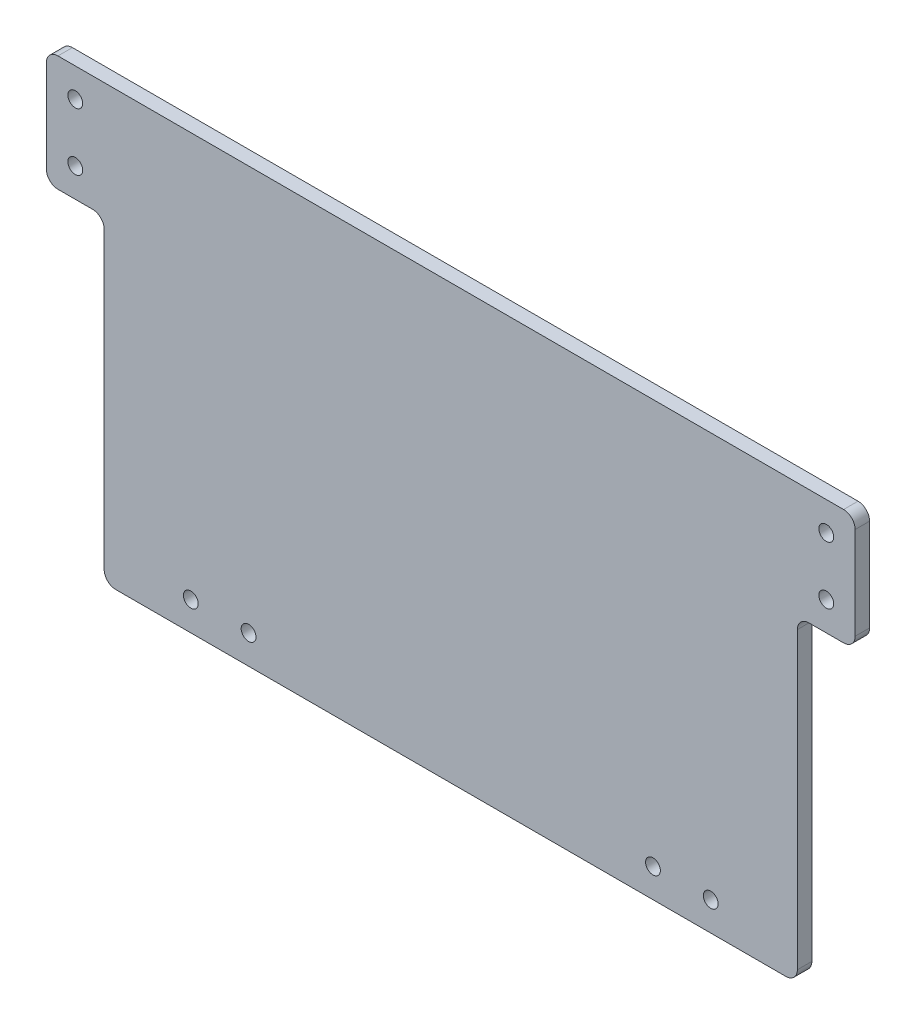
ISO-10303-21;
HEADER;
FILE_DESCRIPTION(('STEP AP214'),'2;1');
FILE_NAME('part.step','',(''),(''),'','','');
FILE_SCHEMA(('AUTOMOTIVE_DESIGN { 1 0 10303 214 1 1 1 1 }'));
ENDSEC;
DATA;
#1=APPLICATION_CONTEXT('core data for automotive mechanical design processes');
#2=APPLICATION_PROTOCOL_DEFINITION('international standard','automotive_design',2000,#1);
#3=PRODUCT_CONTEXT('',#1,'mechanical');
#4=PRODUCT('Part','Part','',(#3));
#5=PRODUCT_RELATED_PRODUCT_CATEGORY('part','',(#4));
#6=PRODUCT_DEFINITION_FORMATION('','',#4);
#7=PRODUCT_DEFINITION_CONTEXT('part definition',#1,'design');
#8=PRODUCT_DEFINITION('design','',#6,#7);
#9=PRODUCT_DEFINITION_SHAPE('','',#8);
#10=(LENGTH_UNIT() NAMED_UNIT(*) SI_UNIT(.MILLI.,.METRE.));
#11=(NAMED_UNIT(*) PLANE_ANGLE_UNIT() SI_UNIT($,.RADIAN.));
#12=(NAMED_UNIT(*) SI_UNIT($,.STERADIAN.) SOLID_ANGLE_UNIT());
#13=UNCERTAINTY_MEASURE_WITH_UNIT(LENGTH_MEASURE(1.E-05),#10,'distance_accuracy_value','');
#14=(GEOMETRIC_REPRESENTATION_CONTEXT(3) GLOBAL_UNCERTAINTY_ASSIGNED_CONTEXT((#13)) GLOBAL_UNIT_ASSIGNED_CONTEXT((#10,
#11,#12)) REPRESENTATION_CONTEXT('',''));
#15=CARTESIAN_POINT('',(0.,0.,0.));
#16=DIRECTION('',(0.,0.,1.));
#17=DIRECTION('',(1.,0.,0.));
#18=AXIS2_PLACEMENT_3D('',#15,#16,#17);
#19=CARTESIAN_POINT('',(152.4,95.25,6.35));
#20=DIRECTION('',(-1.,0.,0.));
#21=DIRECTION('',(0.,0.,1.));
#22=AXIS2_PLACEMENT_3D('',#19,#20,#21);
#23=PLANE('',#22);
#24=DIRECTION('',(0.,1.,0.));
#25=VECTOR('',#24,1.);
#26=CARTESIAN_POINT('',(152.4,95.25,6.35));
#27=LINE('',#26,#25);
#28=CARTESIAN_POINT('',(152.4,-90.17,6.35));
#29=VERTEX_POINT('',#28);
#30=CARTESIAN_POINT('',(152.4,39.37,6.35));
#31=VERTEX_POINT('',#30);
#32=EDGE_CURVE('E258',#29,#31,#27,.T.);
#33=ORIENTED_EDGE('',*,*,#32,.F.);
#34=DIRECTION('',(0.,0.,-1.));
#35=VECTOR('',#34,1.);
#36=CARTESIAN_POINT('',(152.4,-90.17,6.35));
#37=LINE('',#36,#35);
#38=CARTESIAN_POINT('',(152.4,-90.17,0.));
#39=VERTEX_POINT('',#38);
#40=EDGE_CURVE('E212',#29,#39,#37,.T.);
#41=ORIENTED_EDGE('',*,*,#40,.T.);
#42=DIRECTION('',(0.,1.,0.));
#43=VECTOR('',#42,1.);
#44=CARTESIAN_POINT('',(152.4,95.25,0.));
#45=LINE('',#44,#43);
#46=CARTESIAN_POINT('',(152.4,39.37,0.));
#47=VERTEX_POINT('',#46);
#48=EDGE_CURVE('E239',#39,#47,#45,.T.);
#49=ORIENTED_EDGE('',*,*,#48,.T.);
#50=DIRECTION('',(0.,0.,-1.));
#51=VECTOR('',#50,1.);
#52=CARTESIAN_POINT('',(152.4,39.37,6.35));
#53=LINE('',#52,#51);
#54=EDGE_CURVE('E210',#47,#31,#53,.F.);
#55=ORIENTED_EDGE('',*,*,#54,.T.);
#56=EDGE_LOOP('',(#33,#41,#49,#55));
#57=FACE_BOUND('',#56,.T.);
#58=ADVANCED_FACE('F33',(#57),#23,.F.);
#59=CARTESIAN_POINT('',(-152.4,95.25,6.35));
#60=DIRECTION('',(0.,-1.,0.));
#61=DIRECTION('',(0.,0.,-1.));
#62=AXIS2_PLACEMENT_3D('',#59,#60,#61);
#63=PLANE('',#62);
#64=DIRECTION('',(-1.,0.,0.));
#65=VECTOR('',#64,1.);
#66=CARTESIAN_POINT('',(-152.4,95.25,6.35));
#67=LINE('',#66,#65);
#68=CARTESIAN_POINT('',(172.72,95.25,6.35));
#69=VERTEX_POINT('',#68);
#70=CARTESIAN_POINT('',(-172.72,95.25,6.35));
#71=VERTEX_POINT('',#70);
#72=EDGE_CURVE('E313',#69,#71,#67,.T.);
#73=ORIENTED_EDGE('',*,*,#72,.F.);
#74=DIRECTION('',(0.,0.,-1.));
#75=VECTOR('',#74,1.);
#76=CARTESIAN_POINT('',(172.72,95.25,0.));
#77=LINE('',#76,#75);
#78=CARTESIAN_POINT('',(172.72,95.25,0.));
#79=VERTEX_POINT('',#78);
#80=EDGE_CURVE('E227',#69,#79,#77,.T.);
#81=ORIENTED_EDGE('',*,*,#80,.T.);
#82=DIRECTION('',(-1.,0.,0.));
#83=VECTOR('',#82,1.);
#84=CARTESIAN_POINT('',(-152.4,95.25,0.));
#85=LINE('',#84,#83);
#86=CARTESIAN_POINT('',(-172.72,95.25,0.));
#87=VERTEX_POINT('',#86);
#88=EDGE_CURVE('E249',#79,#87,#85,.T.);
#89=ORIENTED_EDGE('',*,*,#88,.T.);
#90=DIRECTION('',(0.,0.,-1.));
#91=VECTOR('',#90,1.);
#92=CARTESIAN_POINT('',(-172.72,95.25,6.35));
#93=LINE('',#92,#91);
#94=EDGE_CURVE('E225',#87,#71,#93,.F.);
#95=ORIENTED_EDGE('',*,*,#94,.T.);
#96=EDGE_LOOP('',(#73,#81,#89,#95));
#97=FACE_BOUND('',#96,.T.);
#98=ADVANCED_FACE('F350',(#97),#63,.F.);
#99=CARTESIAN_POINT('',(-152.4,95.25,6.35));
#100=DIRECTION('',(1.,0.,0.));
#101=DIRECTION('',(0.,1.,0.));
#102=AXIS2_PLACEMENT_3D('',#99,#100,#101);
#103=PLANE('',#102);
#104=DIRECTION('',(0.,-1.,0.));
#105=VECTOR('',#104,1.);
#106=CARTESIAN_POINT('',(-152.4,95.25,6.35));
#107=LINE('',#106,#105);
#108=CARTESIAN_POINT('',(-152.4,39.37,6.35));
#109=VERTEX_POINT('',#108);
#110=CARTESIAN_POINT('',(-152.4,-90.17,6.35));
#111=VERTEX_POINT('',#110);
#112=EDGE_CURVE('E317',#109,#111,#107,.T.);
#113=ORIENTED_EDGE('',*,*,#112,.F.);
#114=DIRECTION('',(0.,0.,-1.));
#115=VECTOR('',#114,1.);
#116=CARTESIAN_POINT('',(-152.4,39.37,0.));
#117=LINE('',#116,#115);
#118=CARTESIAN_POINT('',(-152.4,39.37,0.));
#119=VERTEX_POINT('',#118);
#120=EDGE_CURVE('E203',#109,#119,#117,.T.);
#121=ORIENTED_EDGE('',*,*,#120,.T.);
#122=DIRECTION('',(0.,-1.,0.));
#123=VECTOR('',#122,1.);
#124=CARTESIAN_POINT('',(-152.4,95.25,0.));
#125=LINE('',#124,#123);
#126=CARTESIAN_POINT('',(-152.4,-90.17,0.));
#127=VERTEX_POINT('',#126);
#128=EDGE_CURVE('E322',#119,#127,#125,.T.);
#129=ORIENTED_EDGE('',*,*,#128,.T.);
#130=DIRECTION('',(0.,0.,-1.));
#131=VECTOR('',#130,1.);
#132=CARTESIAN_POINT('',(-152.4,-90.17,6.35));
#133=LINE('',#132,#131);
#134=EDGE_CURVE('E158',#127,#111,#133,.F.);
#135=ORIENTED_EDGE('',*,*,#134,.T.);
#136=EDGE_LOOP('',(#113,#121,#129,#135));
#137=FACE_BOUND('',#136,.T.);
#138=ADVANCED_FACE('F336',(#137),#103,.F.);
#139=CARTESIAN_POINT('',(-152.4,-95.25,6.35));
#140=DIRECTION('',(0.,1.,0.));
#141=DIRECTION('',(0.,0.,1.));
#142=AXIS2_PLACEMENT_3D('',#139,#140,#141);
#143=PLANE('',#142);
#144=DIRECTION('',(1.,0.,0.));
#145=VECTOR('',#144,1.);
#146=CARTESIAN_POINT('',(-152.4,-95.25,6.35));
#147=LINE('',#146,#145);
#148=CARTESIAN_POINT('',(-147.32,-95.25,6.35));
#149=VERTEX_POINT('',#148);
#150=CARTESIAN_POINT('',(147.32,-95.25,6.35));
#151=VERTEX_POINT('',#150);
#152=EDGE_CURVE('E176',#149,#151,#147,.T.);
#153=ORIENTED_EDGE('',*,*,#152,.F.);
#154=DIRECTION('',(0.,0.,-1.));
#155=VECTOR('',#154,1.);
#156=CARTESIAN_POINT('',(-147.32,-95.25,6.35));
#157=LINE('',#156,#155);
#158=CARTESIAN_POINT('',(-147.32,-95.25,0.));
#159=VERTEX_POINT('',#158);
#160=EDGE_CURVE('E207',#149,#159,#157,.T.);
#161=ORIENTED_EDGE('',*,*,#160,.T.);
#162=DIRECTION('',(1.,0.,0.));
#163=VECTOR('',#162,1.);
#164=CARTESIAN_POINT('',(-152.4,-95.25,0.));
#165=LINE('',#164,#163);
#166=CARTESIAN_POINT('',(147.32,-95.25,0.));
#167=VERTEX_POINT('',#166);
#168=EDGE_CURVE('E314',#159,#167,#165,.T.);
#169=ORIENTED_EDGE('',*,*,#168,.T.);
#170=DIRECTION('',(0.,0.,-1.));
#171=VECTOR('',#170,1.);
#172=CARTESIAN_POINT('',(147.32,-95.25,6.35));
#173=LINE('',#172,#171);
#174=EDGE_CURVE('E48',#167,#151,#173,.F.);
#175=ORIENTED_EDGE('',*,*,#174,.T.);
#176=EDGE_LOOP('',(#153,#161,#169,#175));
#177=FACE_BOUND('',#176,.T.);
#178=ADVANCED_FACE('F325',(#177),#143,.F.);
#179=CARTESIAN_POINT('',(0.,0.,6.35));
#180=DIRECTION('',(0.,0.,1.));
#181=DIRECTION('',(1.,0.,0.));
#182=AXIS2_PLACEMENT_3D('',#179,#180,#181);
#183=PLANE('',#182);
#184=CARTESIAN_POINT('',(-88.9,-82.55,6.35));
#185=DIRECTION('',(0.,0.,1.));
#186=DIRECTION('',(1.,0.,0.));
#187=AXIS2_PLACEMENT_3D('',#184,#185,#186);
#188=CIRCLE('',#187,3.26389999999999);
#189=CARTESIAN_POINT('',(-85.6361,-82.55,6.35));
#190=VERTEX_POINT('',#189);
#191=EDGE_CURVE('E294',#190,#190,#188,.T.);
#192=ORIENTED_EDGE('',*,*,#191,.F.);
#193=EDGE_LOOP('',(#192));
#194=FACE_BOUND('',#193,.T.);
#195=CARTESIAN_POINT('',(88.9,-82.55,6.35));
#196=DIRECTION('',(0.,0.,1.));
#197=DIRECTION('',(1.,0.,0.));
#198=AXIS2_PLACEMENT_3D('',#195,#196,#197);
#199=CIRCLE('',#198,3.26389999999999);
#200=CARTESIAN_POINT('',(92.1639,-82.55,6.35));
#201=VERTEX_POINT('',#200);
#202=EDGE_CURVE('E300',#201,#201,#199,.T.);
#203=ORIENTED_EDGE('',*,*,#202,.F.);
#204=EDGE_LOOP('',(#203));
#205=FACE_BOUND('',#204,.T.);
#206=CARTESIAN_POINT('',(114.3,-82.55,6.35));
#207=DIRECTION('',(0.,0.,1.));
#208=DIRECTION('',(1.,0.,0.));
#209=AXIS2_PLACEMENT_3D('',#206,#207,#208);
#210=CIRCLE('',#209,3.26389999999998);
#211=CARTESIAN_POINT('',(117.5639,-82.55,6.35));
#212=VERTEX_POINT('',#211);
#213=EDGE_CURVE('E286',#212,#212,#210,.T.);
#214=ORIENTED_EDGE('',*,*,#213,.F.);
#215=EDGE_LOOP('',(#214));
#216=FACE_BOUND('',#215,.T.);
#217=CARTESIAN_POINT('',(-114.3,-82.55,6.35));
#218=DIRECTION('',(0.,0.,1.));
#219=DIRECTION('',(1.,0.,0.));
#220=AXIS2_PLACEMENT_3D('',#217,#218,#219);
#221=CIRCLE('',#220,3.26389999999998);
#222=CARTESIAN_POINT('',(-111.0361,-82.55,6.35));
#223=VERTEX_POINT('',#222);
#224=EDGE_CURVE('E293',#223,#223,#221,.T.);
#225=ORIENTED_EDGE('',*,*,#224,.F.);
#226=EDGE_LOOP('',(#225));
#227=FACE_BOUND('',#226,.T.);
#228=DIRECTION('',(0.,-1.,0.));
#229=VECTOR('',#228,1.);
#230=CARTESIAN_POINT('',(-177.8,95.25,6.35));
#231=LINE('',#230,#229);
#232=CARTESIAN_POINT('',(-177.8,90.17,6.35));
#233=VERTEX_POINT('',#232);
#234=CARTESIAN_POINT('',(-177.8,49.53,6.35));
#235=VERTEX_POINT('',#234);
#236=EDGE_CURVE('E154',#233,#235,#231,.T.);
#237=ORIENTED_EDGE('',*,*,#236,.T.);
#238=CARTESIAN_POINT('',(-172.72,49.53,6.35));
#239=DIRECTION('',(0.,0.,1.));
#240=DIRECTION('',(1.,0.,0.));
#241=AXIS2_PLACEMENT_3D('',#238,#239,#240);
#242=CIRCLE('',#241,5.08);
#243=CARTESIAN_POINT('',(-172.72,44.45,6.35));
#244=VERTEX_POINT('',#243);
#245=EDGE_CURVE('E147',#235,#244,#242,.T.);
#246=ORIENTED_EDGE('',*,*,#245,.T.);
#247=DIRECTION('',(1.,0.,0.));
#248=VECTOR('',#247,1.);
#249=CARTESIAN_POINT('',(-152.4,44.45,6.35));
#250=LINE('',#249,#248);
#251=CARTESIAN_POINT('',(-157.48,44.45,6.35));
#252=VERTEX_POINT('',#251);
#253=EDGE_CURVE('E151',#244,#252,#250,.T.);
#254=ORIENTED_EDGE('',*,*,#253,.T.);
#255=CARTESIAN_POINT('',(-157.48,39.37,6.35));
#256=DIRECTION('',(0.,0.,1.));
#257=DIRECTION('',(1.,0.,0.));
#258=AXIS2_PLACEMENT_3D('',#255,#256,#257);
#259=CIRCLE('',#258,5.08);
#260=EDGE_CURVE('E232',#252,#109,#259,.F.);
#261=ORIENTED_EDGE('',*,*,#260,.T.);
#262=ORIENTED_EDGE('',*,*,#112,.T.);
#263=CARTESIAN_POINT('',(-147.32,-90.17,6.35));
#264=DIRECTION('',(0.,0.,1.));
#265=DIRECTION('',(1.,0.,0.));
#266=AXIS2_PLACEMENT_3D('',#263,#264,#265);
#267=CIRCLE('',#266,5.08);
#268=EDGE_CURVE('E55',#111,#149,#267,.T.);
#269=ORIENTED_EDGE('',*,*,#268,.T.);
#270=ORIENTED_EDGE('',*,*,#152,.T.);
#271=CARTESIAN_POINT('',(147.32,-90.17,6.35));
#272=DIRECTION('',(0.,0.,1.));
#273=DIRECTION('',(1.,0.,0.));
#274=AXIS2_PLACEMENT_3D('',#271,#272,#273);
#275=CIRCLE('',#274,5.08);
#276=EDGE_CURVE('E199',#151,#29,#275,.T.);
#277=ORIENTED_EDGE('',*,*,#276,.T.);
#278=ORIENTED_EDGE('',*,*,#32,.T.);
#279=CARTESIAN_POINT('',(157.48,39.37,6.35));
#280=DIRECTION('',(0.,0.,1.));
#281=DIRECTION('',(1.,0.,0.));
#282=AXIS2_PLACEMENT_3D('',#279,#280,#281);
#283=CIRCLE('',#282,5.08);
#284=CARTESIAN_POINT('',(157.48,44.45,6.35));
#285=VERTEX_POINT('',#284);
#286=EDGE_CURVE('E11',#31,#285,#283,.F.);
#287=ORIENTED_EDGE('',*,*,#286,.T.);
#288=DIRECTION('',(-1.,0.,0.));
#289=VECTOR('',#288,1.);
#290=CARTESIAN_POINT('',(152.4,44.45,6.35));
#291=LINE('',#290,#289);
#292=CARTESIAN_POINT('',(172.72,44.45,6.35));
#293=VERTEX_POINT('',#292);
#294=EDGE_CURVE('E256',#293,#285,#291,.T.);
#295=ORIENTED_EDGE('',*,*,#294,.F.);
#296=CARTESIAN_POINT('',(172.72,49.53,6.35));
#297=DIRECTION('',(0.,0.,1.));
#298=DIRECTION('',(1.,0.,0.));
#299=AXIS2_PLACEMENT_3D('',#296,#297,#298);
#300=CIRCLE('',#299,5.08);
#301=CARTESIAN_POINT('',(177.8,49.53,6.35));
#302=VERTEX_POINT('',#301);
#303=EDGE_CURVE('E197',#293,#302,#300,.T.);
#304=ORIENTED_EDGE('',*,*,#303,.T.);
#305=DIRECTION('',(0.,-1.,0.));
#306=VECTOR('',#305,1.);
#307=CARTESIAN_POINT('',(177.8,95.25,6.35));
#308=LINE('',#307,#306);
#309=CARTESIAN_POINT('',(177.8,90.17,6.35));
#310=VERTEX_POINT('',#309);
#311=EDGE_CURVE('E262',#310,#302,#308,.T.);
#312=ORIENTED_EDGE('',*,*,#311,.F.);
#313=CARTESIAN_POINT('',(172.72,90.17,6.35));
#314=DIRECTION('',(0.,0.,1.));
#315=DIRECTION('',(1.,0.,0.));
#316=AXIS2_PLACEMENT_3D('',#313,#314,#315);
#317=CIRCLE('',#316,5.08);
#318=EDGE_CURVE('E195',#310,#69,#317,.T.);
#319=ORIENTED_EDGE('',*,*,#318,.T.);
#320=ORIENTED_EDGE('',*,*,#72,.T.);
#321=CARTESIAN_POINT('',(-172.72,90.17,6.35));
#322=DIRECTION('',(0.,0.,1.));
#323=DIRECTION('',(1.,0.,0.));
#324=AXIS2_PLACEMENT_3D('',#321,#322,#323);
#325=CIRCLE('',#324,5.08);
#326=EDGE_CURVE('E193',#71,#233,#325,.T.);
#327=ORIENTED_EDGE('',*,*,#326,.T.);
#328=EDGE_LOOP('',(#237,#246,#254,#261,#262,#269,#270,#277,#278,#287,#295,#304,#312,#319,#320,#327));
#329=FACE_BOUND('',#328,.T.);
#330=CARTESIAN_POINT('',(-165.1,57.15,6.35));
#331=DIRECTION('',(0.,0.,1.));
#332=DIRECTION('',(1.,0.,0.));
#333=AXIS2_PLACEMENT_3D('',#330,#331,#332);
#334=CIRCLE('',#333,3.26389999999998);
#335=CARTESIAN_POINT('',(-161.8361,57.15,6.35));
#336=VERTEX_POINT('',#335);
#337=EDGE_CURVE('E272',#336,#336,#334,.T.);
#338=ORIENTED_EDGE('',*,*,#337,.F.);
#339=EDGE_LOOP('',(#338));
#340=FACE_BOUND('',#339,.T.);
#341=CARTESIAN_POINT('',(-165.1,82.55,6.35));
#342=DIRECTION('',(0.,0.,1.));
#343=DIRECTION('',(1.,0.,0.));
#344=AXIS2_PLACEMENT_3D('',#341,#342,#343);
#345=CIRCLE('',#344,3.26389999999998);
#346=CARTESIAN_POINT('',(-161.8361,82.55,6.35));
#347=VERTEX_POINT('',#346);
#348=EDGE_CURVE('E168',#347,#347,#345,.T.);
#349=ORIENTED_EDGE('',*,*,#348,.F.);
#350=EDGE_LOOP('',(#349));
#351=FACE_BOUND('',#350,.T.);
#352=CARTESIAN_POINT('',(165.1,57.15,6.35));
#353=DIRECTION('',(0.,0.,1.));
#354=DIRECTION('',(1.,0.,0.));
#355=AXIS2_PLACEMENT_3D('',#352,#353,#354);
#356=CIRCLE('',#355,3.26389999999998);
#357=CARTESIAN_POINT('',(168.3639,57.15,6.35));
#358=VERTEX_POINT('',#357);
#359=EDGE_CURVE('E268',#358,#358,#356,.F.);
#360=ORIENTED_EDGE('',*,*,#359,.T.);
#361=EDGE_LOOP('',(#360));
#362=FACE_BOUND('',#361,.T.);
#363=CARTESIAN_POINT('',(165.1,82.55,6.35));
#364=DIRECTION('',(0.,0.,1.));
#365=DIRECTION('',(1.,0.,0.));
#366=AXIS2_PLACEMENT_3D('',#363,#364,#365);
#367=CIRCLE('',#366,3.26389999999998);
#368=CARTESIAN_POINT('',(168.3639,82.55,6.35));
#369=VERTEX_POINT('',#368);
#370=EDGE_CURVE('E289',#369,#369,#367,.F.);
#371=ORIENTED_EDGE('',*,*,#370,.T.);
#372=EDGE_LOOP('',(#371));
#373=FACE_BOUND('',#372,.T.);
#374=ADVANCED_FACE('F149',(#194,#205,#216,#227,#329,#340,#351,#362,#373),#183,.T.);
#375=CARTESIAN_POINT('',(0.,0.,0.));
#376=DIRECTION('',(0.,0.,1.));
#377=DIRECTION('',(1.,0.,0.));
#378=AXIS2_PLACEMENT_3D('',#375,#376,#377);
#379=PLANE('',#378);
#380=CARTESIAN_POINT('',(-88.9,-82.55,0.));
#381=DIRECTION('',(0.,0.,1.));
#382=DIRECTION('',(1.,0.,0.));
#383=AXIS2_PLACEMENT_3D('',#380,#381,#382);
#384=CIRCLE('',#383,3.26389999999999);
#385=CARTESIAN_POINT('',(-85.6361,-82.55,0.));
#386=VERTEX_POINT('',#385);
#387=EDGE_CURVE('E290',#386,#386,#384,.T.);
#388=ORIENTED_EDGE('',*,*,#387,.T.);
#389=EDGE_LOOP('',(#388));
#390=FACE_BOUND('',#389,.T.);
#391=CARTESIAN_POINT('',(88.9,-82.55,0.));
#392=DIRECTION('',(0.,0.,1.));
#393=DIRECTION('',(1.,0.,0.));
#394=AXIS2_PLACEMENT_3D('',#391,#392,#393);
#395=CIRCLE('',#394,3.26389999999999);
#396=CARTESIAN_POINT('',(92.1639,-82.55,0.));
#397=VERTEX_POINT('',#396);
#398=EDGE_CURVE('E297',#397,#397,#395,.T.);
#399=ORIENTED_EDGE('',*,*,#398,.T.);
#400=EDGE_LOOP('',(#399));
#401=FACE_BOUND('',#400,.T.);
#402=CARTESIAN_POINT('',(114.3,-82.55,0.));
#403=DIRECTION('',(0.,0.,1.));
#404=DIRECTION('',(1.,0.,0.));
#405=AXIS2_PLACEMENT_3D('',#402,#403,#404);
#406=CIRCLE('',#405,3.26389999999998);
#407=CARTESIAN_POINT('',(117.5639,-82.55,0.));
#408=VERTEX_POINT('',#407);
#409=EDGE_CURVE('E303',#408,#408,#406,.T.);
#410=ORIENTED_EDGE('',*,*,#409,.T.);
#411=EDGE_LOOP('',(#410));
#412=FACE_BOUND('',#411,.T.);
#413=CARTESIAN_POINT('',(-114.3,-82.55,0.));
#414=DIRECTION('',(0.,0.,1.));
#415=DIRECTION('',(1.,0.,0.));
#416=AXIS2_PLACEMENT_3D('',#413,#414,#415);
#417=CIRCLE('',#416,3.26389999999998);
#418=CARTESIAN_POINT('',(-111.0361,-82.55,0.));
#419=VERTEX_POINT('',#418);
#420=EDGE_CURVE('E250',#419,#419,#417,.T.);
#421=ORIENTED_EDGE('',*,*,#420,.T.);
#422=EDGE_LOOP('',(#421));
#423=FACE_BOUND('',#422,.T.);
#424=DIRECTION('',(1.,0.,0.));
#425=VECTOR('',#424,1.);
#426=CARTESIAN_POINT('',(-152.4,44.45,0.));
#427=LINE('',#426,#425);
#428=CARTESIAN_POINT('',(-172.72,44.45,0.));
#429=VERTEX_POINT('',#428);
#430=CARTESIAN_POINT('',(-157.48,44.45,0.));
#431=VERTEX_POINT('',#430);
#432=EDGE_CURVE('E284',#429,#431,#427,.T.);
#433=ORIENTED_EDGE('',*,*,#432,.F.);
#434=CARTESIAN_POINT('',(-172.72,49.53,0.));
#435=DIRECTION('',(0.,0.,1.));
#436=DIRECTION('',(1.,0.,0.));
#437=AXIS2_PLACEMENT_3D('',#434,#435,#436);
#438=CIRCLE('',#437,5.08);
#439=CARTESIAN_POINT('',(-177.8,49.53,0.));
#440=VERTEX_POINT('',#439);
#441=EDGE_CURVE('E171',#429,#440,#438,.F.);
#442=ORIENTED_EDGE('',*,*,#441,.T.);
#443=DIRECTION('',(0.,-1.,0.));
#444=VECTOR('',#443,1.);
#445=CARTESIAN_POINT('',(-177.8,95.25,0.));
#446=LINE('',#445,#444);
#447=CARTESIAN_POINT('',(-177.8,90.17,0.));
#448=VERTEX_POINT('',#447);
#449=EDGE_CURVE('E281',#448,#440,#446,.T.);
#450=ORIENTED_EDGE('',*,*,#449,.F.);
#451=CARTESIAN_POINT('',(-172.72,90.17,0.));
#452=DIRECTION('',(0.,0.,1.));
#453=DIRECTION('',(1.,0.,0.));
#454=AXIS2_PLACEMENT_3D('',#451,#452,#453);
#455=CIRCLE('',#454,5.08);
#456=EDGE_CURVE('E172',#448,#87,#455,.F.);
#457=ORIENTED_EDGE('',*,*,#456,.T.);
#458=ORIENTED_EDGE('',*,*,#88,.F.);
#459=CARTESIAN_POINT('',(172.72,90.17,0.));
#460=DIRECTION('',(0.,0.,1.));
#461=DIRECTION('',(1.,0.,0.));
#462=AXIS2_PLACEMENT_3D('',#459,#460,#461);
#463=CIRCLE('',#462,5.08);
#464=CARTESIAN_POINT('',(177.8,90.17,0.));
#465=VERTEX_POINT('',#464);
#466=EDGE_CURVE('E174',#79,#465,#463,.F.);
#467=ORIENTED_EDGE('',*,*,#466,.T.);
#468=DIRECTION('',(0.,-1.,0.));
#469=VECTOR('',#468,1.);
#470=CARTESIAN_POINT('',(177.8,95.25,0.));
#471=LINE('',#470,#469);
#472=CARTESIAN_POINT('',(177.8,49.53,0.));
#473=VERTEX_POINT('',#472);
#474=EDGE_CURVE('E358',#465,#473,#471,.T.);
#475=ORIENTED_EDGE('',*,*,#474,.T.);
#476=CARTESIAN_POINT('',(172.72,49.53,0.));
#477=DIRECTION('',(0.,0.,1.));
#478=DIRECTION('',(1.,0.,0.));
#479=AXIS2_PLACEMENT_3D('',#476,#477,#478);
#480=CIRCLE('',#479,5.08);
#481=CARTESIAN_POINT('',(172.72,44.45,0.));
#482=VERTEX_POINT('',#481);
#483=EDGE_CURVE('E181',#473,#482,#480,.F.);
#484=ORIENTED_EDGE('',*,*,#483,.T.);
#485=DIRECTION('',(-1.,0.,0.));
#486=VECTOR('',#485,1.);
#487=CARTESIAN_POINT('',(152.4,44.45,0.));
#488=LINE('',#487,#486);
#489=CARTESIAN_POINT('',(157.48,44.45,0.));
#490=VERTEX_POINT('',#489);
#491=EDGE_CURVE('E241',#482,#490,#488,.T.);
#492=ORIENTED_EDGE('',*,*,#491,.T.);
#493=CARTESIAN_POINT('',(157.48,39.37,0.));
#494=DIRECTION('',(0.,0.,1.));
#495=DIRECTION('',(1.,0.,0.));
#496=AXIS2_PLACEMENT_3D('',#493,#494,#495);
#497=CIRCLE('',#496,5.08);
#498=EDGE_CURVE('E41',#490,#47,#497,.T.);
#499=ORIENTED_EDGE('',*,*,#498,.T.);
#500=ORIENTED_EDGE('',*,*,#48,.F.);
#501=CARTESIAN_POINT('',(147.32,-90.17,0.));
#502=DIRECTION('',(0.,0.,1.));
#503=DIRECTION('',(1.,0.,0.));
#504=AXIS2_PLACEMENT_3D('',#501,#502,#503);
#505=CIRCLE('',#504,5.08);
#506=EDGE_CURVE('E183',#39,#167,#505,.F.);
#507=ORIENTED_EDGE('',*,*,#506,.T.);
#508=ORIENTED_EDGE('',*,*,#168,.F.);
#509=CARTESIAN_POINT('',(-147.32,-90.17,0.));
#510=DIRECTION('',(0.,0.,1.));
#511=DIRECTION('',(1.,0.,0.));
#512=AXIS2_PLACEMENT_3D('',#509,#510,#511);
#513=CIRCLE('',#512,5.08);
#514=EDGE_CURVE('E185',#159,#127,#513,.F.);
#515=ORIENTED_EDGE('',*,*,#514,.T.);
#516=ORIENTED_EDGE('',*,*,#128,.F.);
#517=CARTESIAN_POINT('',(-157.48,39.37,0.));
#518=DIRECTION('',(0.,0.,1.));
#519=DIRECTION('',(1.,0.,0.));
#520=AXIS2_PLACEMENT_3D('',#517,#518,#519);
#521=CIRCLE('',#520,5.08);
#522=EDGE_CURVE('E230',#119,#431,#521,.T.);
#523=ORIENTED_EDGE('',*,*,#522,.T.);
#524=EDGE_LOOP('',(#433,#442,#450,#457,#458,#467,#475,#484,#492,#499,#500,#507,#508,#515,#516,#523));
#525=FACE_BOUND('',#524,.T.);
#526=CARTESIAN_POINT('',(-165.1,82.55,0.));
#527=DIRECTION('',(0.,0.,1.));
#528=DIRECTION('',(1.,0.,0.));
#529=AXIS2_PLACEMENT_3D('',#526,#527,#528);
#530=CIRCLE('',#529,3.26389999999998);
#531=CARTESIAN_POINT('',(-161.8361,82.55,0.));
#532=VERTEX_POINT('',#531);
#533=EDGE_CURVE('E278',#532,#532,#530,.T.);
#534=ORIENTED_EDGE('',*,*,#533,.T.);
#535=EDGE_LOOP('',(#534));
#536=FACE_BOUND('',#535,.T.);
#537=CARTESIAN_POINT('',(-165.1,57.15,0.));
#538=DIRECTION('',(0.,0.,1.));
#539=DIRECTION('',(1.,0.,0.));
#540=AXIS2_PLACEMENT_3D('',#537,#538,#539);
#541=CIRCLE('',#540,3.26389999999998);
#542=CARTESIAN_POINT('',(-161.8361,57.15,0.));
#543=VERTEX_POINT('',#542);
#544=EDGE_CURVE('E275',#543,#543,#541,.T.);
#545=ORIENTED_EDGE('',*,*,#544,.T.);
#546=EDGE_LOOP('',(#545));
#547=FACE_BOUND('',#546,.T.);
#548=CARTESIAN_POINT('',(165.1,57.15,0.));
#549=DIRECTION('',(0.,0.,-1.));
#550=DIRECTION('',(-1.,0.,0.));
#551=AXIS2_PLACEMENT_3D('',#548,#549,#550);
#552=CIRCLE('',#551,3.26389999999998);
#553=CARTESIAN_POINT('',(161.8361,57.15,0.));
#554=VERTEX_POINT('',#553);
#555=EDGE_CURVE('E363',#554,#554,#552,.T.);
#556=ORIENTED_EDGE('',*,*,#555,.F.);
#557=EDGE_LOOP('',(#556));
#558=FACE_BOUND('',#557,.T.);
#559=CARTESIAN_POINT('',(165.1,82.55,0.));
#560=DIRECTION('',(0.,0.,-1.));
#561=DIRECTION('',(-1.,0.,0.));
#562=AXIS2_PLACEMENT_3D('',#559,#560,#561);
#563=CIRCLE('',#562,3.26389999999998);
#564=CARTESIAN_POINT('',(161.8361,82.55,0.));
#565=VERTEX_POINT('',#564);
#566=EDGE_CURVE('E265',#565,#565,#563,.T.);
#567=ORIENTED_EDGE('',*,*,#566,.F.);
#568=EDGE_LOOP('',(#567));
#569=FACE_BOUND('',#568,.T.);
#570=ADVANCED_FACE('F237',(#390,#401,#412,#423,#525,#536,#547,#558,#569),#379,.F.);
#571=CARTESIAN_POINT('',(-114.3,-82.55,0.));
#572=DIRECTION('',(0.,0.,1.));
#573=DIRECTION('',(1.,0.,0.));
#574=AXIS2_PLACEMENT_3D('',#571,#572,#573);
#575=CYLINDRICAL_SURFACE('',#574,3.26389999999998);
#576=ORIENTED_EDGE('',*,*,#420,.F.);
#577=EDGE_LOOP('',(#576));
#578=FACE_BOUND('',#577,.T.);
#579=ORIENTED_EDGE('',*,*,#224,.T.);
#580=EDGE_LOOP('',(#579));
#581=FACE_BOUND('',#580,.T.);
#582=ADVANCED_FACE('F506',(#578,#581),#575,.F.);
#583=CARTESIAN_POINT('',(114.3,-82.55,0.));
#584=DIRECTION('',(0.,0.,1.));
#585=DIRECTION('',(1.,0.,0.));
#586=AXIS2_PLACEMENT_3D('',#583,#584,#585);
#587=CYLINDRICAL_SURFACE('',#586,3.26389999999998);
#588=ORIENTED_EDGE('',*,*,#409,.F.);
#589=EDGE_LOOP('',(#588));
#590=FACE_BOUND('',#589,.T.);
#591=ORIENTED_EDGE('',*,*,#213,.T.);
#592=EDGE_LOOP('',(#591));
#593=FACE_BOUND('',#592,.T.);
#594=ADVANCED_FACE('F586',(#590,#593),#587,.F.);
#595=CARTESIAN_POINT('',(88.9,-82.55,0.));
#596=DIRECTION('',(0.,0.,1.));
#597=DIRECTION('',(1.,0.,0.));
#598=AXIS2_PLACEMENT_3D('',#595,#596,#597);
#599=CYLINDRICAL_SURFACE('',#598,3.26389999999999);
#600=ORIENTED_EDGE('',*,*,#398,.F.);
#601=EDGE_LOOP('',(#600));
#602=FACE_BOUND('',#601,.T.);
#603=ORIENTED_EDGE('',*,*,#202,.T.);
#604=EDGE_LOOP('',(#603));
#605=FACE_BOUND('',#604,.T.);
#606=ADVANCED_FACE('F576',(#602,#605),#599,.F.);
#607=CARTESIAN_POINT('',(-88.9,-82.55,0.));
#608=DIRECTION('',(0.,0.,1.));
#609=DIRECTION('',(1.,0.,0.));
#610=AXIS2_PLACEMENT_3D('',#607,#608,#609);
#611=CYLINDRICAL_SURFACE('',#610,3.26389999999999);
#612=ORIENTED_EDGE('',*,*,#387,.F.);
#613=EDGE_LOOP('',(#612));
#614=FACE_BOUND('',#613,.T.);
#615=ORIENTED_EDGE('',*,*,#191,.T.);
#616=EDGE_LOOP('',(#615));
#617=FACE_BOUND('',#616,.T.);
#618=ADVANCED_FACE('F496',(#614,#617),#611,.F.);
#619=CARTESIAN_POINT('',(-152.4,44.45,63.1461266284947));
#620=DIRECTION('',(0.,1.,0.));
#621=DIRECTION('',(0.,0.,1.));
#622=AXIS2_PLACEMENT_3D('',#619,#620,#621);
#623=PLANE('',#622);
#624=ORIENTED_EDGE('',*,*,#253,.F.);
#625=DIRECTION('',(0.,0.,-1.));
#626=VECTOR('',#625,1.);
#627=CARTESIAN_POINT('',(-172.72,44.45,63.1461266284947));
#628=LINE('',#627,#626);
#629=EDGE_CURVE('E164',#244,#429,#628,.T.);
#630=ORIENTED_EDGE('',*,*,#629,.T.);
#631=ORIENTED_EDGE('',*,*,#432,.T.);
#632=DIRECTION('',(0.,0.,-1.));
#633=VECTOR('',#632,1.);
#634=CARTESIAN_POINT('',(-157.48,44.45,6.35));
#635=LINE('',#634,#633);
#636=EDGE_CURVE('E167',#431,#252,#635,.F.);
#637=ORIENTED_EDGE('',*,*,#636,.T.);
#638=EDGE_LOOP('',(#624,#630,#631,#637));
#639=FACE_BOUND('',#638,.T.);
#640=ADVANCED_FACE('F162',(#639),#623,.F.);
#641=CARTESIAN_POINT('',(-177.8,95.25,63.1461266284947));
#642=DIRECTION('',(1.,0.,0.));
#643=DIRECTION('',(0.,0.,-1.));
#644=AXIS2_PLACEMENT_3D('',#641,#642,#643);
#645=PLANE('',#644);
#646=ORIENTED_EDGE('',*,*,#449,.T.);
#647=DIRECTION('',(0.,0.,-1.));
#648=VECTOR('',#647,1.);
#649=CARTESIAN_POINT('',(-177.8,49.53,63.1461266284947));
#650=LINE('',#649,#648);
#651=EDGE_CURVE('E191',#440,#235,#650,.F.);
#652=ORIENTED_EDGE('',*,*,#651,.T.);
#653=ORIENTED_EDGE('',*,*,#236,.F.);
#654=DIRECTION('',(0.,0.,-1.));
#655=VECTOR('',#654,1.);
#656=CARTESIAN_POINT('',(-177.8,90.17,63.1461266284947));
#657=LINE('',#656,#655);
#658=EDGE_CURVE('E188',#233,#448,#657,.T.);
#659=ORIENTED_EDGE('',*,*,#658,.T.);
#660=EDGE_LOOP('',(#646,#652,#653,#659));
#661=FACE_BOUND('',#660,.T.);
#662=ADVANCED_FACE('F342',(#661),#645,.F.);
#663=CARTESIAN_POINT('',(-165.1,82.55,63.1461266284947));
#664=DIRECTION('',(0.,0.,-1.));
#665=DIRECTION('',(-1.,0.,0.));
#666=AXIS2_PLACEMENT_3D('',#663,#664,#665);
#667=CYLINDRICAL_SURFACE('',#666,3.26389999999998);
#668=ORIENTED_EDGE('',*,*,#533,.F.);
#669=EDGE_LOOP('',(#668));
#670=FACE_BOUND('',#669,.T.);
#671=ORIENTED_EDGE('',*,*,#348,.T.);
#672=EDGE_LOOP('',(#671));
#673=FACE_BOUND('',#672,.T.);
#674=ADVANCED_FACE('F485',(#670,#673),#667,.F.);
#675=CARTESIAN_POINT('',(-165.1,57.15,63.1461266284947));
#676=DIRECTION('',(0.,0.,-1.));
#677=DIRECTION('',(-1.,0.,0.));
#678=AXIS2_PLACEMENT_3D('',#675,#676,#677);
#679=CYLINDRICAL_SURFACE('',#678,3.26389999999998);
#680=ORIENTED_EDGE('',*,*,#544,.F.);
#681=EDGE_LOOP('',(#680));
#682=FACE_BOUND('',#681,.T.);
#683=ORIENTED_EDGE('',*,*,#337,.T.);
#684=EDGE_LOOP('',(#683));
#685=FACE_BOUND('',#684,.T.);
#686=ADVANCED_FACE('F474',(#682,#685),#679,.F.);
#687=CARTESIAN_POINT('',(152.4,44.45,63.1461266284947));
#688=DIRECTION('',(0.,-1.,0.));
#689=DIRECTION('',(0.,0.,-1.));
#690=AXIS2_PLACEMENT_3D('',#687,#688,#689);
#691=PLANE('',#690);
#692=ORIENTED_EDGE('',*,*,#294,.T.);
#693=DIRECTION('',(0.,0.,-1.));
#694=VECTOR('',#693,1.);
#695=CARTESIAN_POINT('',(157.48,44.45,63.1461266284947));
#696=LINE('',#695,#694);
#697=EDGE_CURVE('E217',#285,#490,#696,.T.);
#698=ORIENTED_EDGE('',*,*,#697,.T.);
#699=ORIENTED_EDGE('',*,*,#491,.F.);
#700=DIRECTION('',(0.,0.,-1.));
#701=VECTOR('',#700,1.);
#702=CARTESIAN_POINT('',(172.72,44.45,63.1461266284947));
#703=LINE('',#702,#701);
#704=EDGE_CURVE('E215',#482,#293,#703,.F.);
#705=ORIENTED_EDGE('',*,*,#704,.T.);
#706=EDGE_LOOP('',(#692,#698,#699,#705));
#707=FACE_BOUND('',#706,.T.);
#708=ADVANCED_FACE('F260',(#707),#691,.T.);
#709=CARTESIAN_POINT('',(177.8,95.25,63.1461266284947));
#710=DIRECTION('',(1.,0.,0.));
#711=DIRECTION('',(0.,0.,-1.));
#712=AXIS2_PLACEMENT_3D('',#709,#710,#711);
#713=PLANE('',#712);
#714=ORIENTED_EDGE('',*,*,#311,.T.);
#715=DIRECTION('',(0.,0.,-1.));
#716=VECTOR('',#715,1.);
#717=CARTESIAN_POINT('',(177.8,49.53,63.1461266284947));
#718=LINE('',#717,#716);
#719=EDGE_CURVE('E222',#302,#473,#718,.T.);
#720=ORIENTED_EDGE('',*,*,#719,.T.);
#721=ORIENTED_EDGE('',*,*,#474,.F.);
#722=DIRECTION('',(0.,0.,-1.));
#723=VECTOR('',#722,1.);
#724=CARTESIAN_POINT('',(177.8,90.17,6.35));
#725=LINE('',#724,#723);
#726=EDGE_CURVE('E220',#465,#310,#725,.F.);
#727=ORIENTED_EDGE('',*,*,#726,.T.);
#728=EDGE_LOOP('',(#714,#720,#721,#727));
#729=FACE_BOUND('',#728,.T.);
#730=ADVANCED_FACE('F360',(#729),#713,.T.);
#731=CARTESIAN_POINT('',(165.1,82.55,63.1461266284947));
#732=DIRECTION('',(0.,0.,-1.));
#733=DIRECTION('',(-1.,0.,0.));
#734=AXIS2_PLACEMENT_3D('',#731,#732,#733);
#735=CYLINDRICAL_SURFACE('',#734,3.26389999999998);
#736=ORIENTED_EDGE('',*,*,#566,.T.);
#737=EDGE_LOOP('',(#736));
#738=FACE_BOUND('',#737,.T.);
#739=ORIENTED_EDGE('',*,*,#370,.F.);
#740=EDGE_LOOP('',(#739));
#741=FACE_BOUND('',#740,.T.);
#742=ADVANCED_FACE('F379',(#738,#741),#735,.F.);
#743=CARTESIAN_POINT('',(165.1,57.15,63.1461266284947));
#744=DIRECTION('',(0.,0.,-1.));
#745=DIRECTION('',(-1.,0.,0.));
#746=AXIS2_PLACEMENT_3D('',#743,#744,#745);
#747=CYLINDRICAL_SURFACE('',#746,3.26389999999998);
#748=ORIENTED_EDGE('',*,*,#555,.T.);
#749=EDGE_LOOP('',(#748));
#750=FACE_BOUND('',#749,.T.);
#751=ORIENTED_EDGE('',*,*,#359,.F.);
#752=EDGE_LOOP('',(#751));
#753=FACE_BOUND('',#752,.T.);
#754=ADVANCED_FACE('F377',(#750,#753),#747,.F.);
#755=CARTESIAN_POINT('',(-172.72,49.53,63.1461266284947));
#756=DIRECTION('',(0.,0.,-1.));
#757=DIRECTION('',(-1.,0.,0.));
#758=AXIS2_PLACEMENT_3D('',#755,#756,#757);
#759=CYLINDRICAL_SURFACE('',#758,5.08);
#760=ORIENTED_EDGE('',*,*,#245,.F.);
#761=ORIENTED_EDGE('',*,*,#651,.F.);
#762=ORIENTED_EDGE('',*,*,#441,.F.);
#763=ORIENTED_EDGE('',*,*,#629,.F.);
#764=EDGE_LOOP('',(#760,#761,#762,#763));
#765=FACE_BOUND('',#764,.T.);
#766=ADVANCED_FACE('F170',(#765),#759,.T.);
#767=CARTESIAN_POINT('',(-157.48,39.37,6.35));
#768=DIRECTION('',(0.,0.,1.));
#769=DIRECTION('',(1.,0.,0.));
#770=AXIS2_PLACEMENT_3D('',#767,#768,#769);
#771=CYLINDRICAL_SURFACE('',#770,5.08);
#772=ORIENTED_EDGE('',*,*,#260,.F.);
#773=ORIENTED_EDGE('',*,*,#636,.F.);
#774=ORIENTED_EDGE('',*,*,#522,.F.);
#775=ORIENTED_EDGE('',*,*,#120,.F.);
#776=EDGE_LOOP('',(#772,#773,#774,#775));
#777=FACE_BOUND('',#776,.T.);
#778=ADVANCED_FACE('F339',(#777),#771,.F.);
#779=CARTESIAN_POINT('',(-147.32,-90.17,6.35));
#780=DIRECTION('',(0.,0.,-1.));
#781=DIRECTION('',(-1.,0.,0.));
#782=AXIS2_PLACEMENT_3D('',#779,#780,#781);
#783=CYLINDRICAL_SURFACE('',#782,5.08);
#784=ORIENTED_EDGE('',*,*,#268,.F.);
#785=ORIENTED_EDGE('',*,*,#134,.F.);
#786=ORIENTED_EDGE('',*,*,#514,.F.);
#787=ORIENTED_EDGE('',*,*,#160,.F.);
#788=EDGE_LOOP('',(#784,#785,#786,#787));
#789=FACE_BOUND('',#788,.T.);
#790=ADVANCED_FACE('F331',(#789),#783,.T.);
#791=CARTESIAN_POINT('',(147.32,-90.17,6.35));
#792=DIRECTION('',(0.,0.,-1.));
#793=DIRECTION('',(-1.,0.,0.));
#794=AXIS2_PLACEMENT_3D('',#791,#792,#793);
#795=CYLINDRICAL_SURFACE('',#794,5.08);
#796=ORIENTED_EDGE('',*,*,#276,.F.);
#797=ORIENTED_EDGE('',*,*,#174,.F.);
#798=ORIENTED_EDGE('',*,*,#506,.F.);
#799=ORIENTED_EDGE('',*,*,#40,.F.);
#800=EDGE_LOOP('',(#796,#797,#798,#799));
#801=FACE_BOUND('',#800,.T.);
#802=ADVANCED_FACE('F329',(#801),#795,.T.);
#803=CARTESIAN_POINT('',(157.48,39.37,63.1461266284947));
#804=DIRECTION('',(0.,0.,-1.));
#805=DIRECTION('',(-1.,0.,0.));
#806=AXIS2_PLACEMENT_3D('',#803,#804,#805);
#807=CYLINDRICAL_SURFACE('',#806,5.08);
#808=ORIENTED_EDGE('',*,*,#286,.F.);
#809=ORIENTED_EDGE('',*,*,#54,.F.);
#810=ORIENTED_EDGE('',*,*,#498,.F.);
#811=ORIENTED_EDGE('',*,*,#697,.F.);
#812=EDGE_LOOP('',(#808,#809,#810,#811));
#813=FACE_BOUND('',#812,.T.);
#814=ADVANCED_FACE('F253',(#813),#807,.F.);
#815=CARTESIAN_POINT('',(172.72,49.53,63.1461266284947));
#816=DIRECTION('',(0.,0.,-1.));
#817=DIRECTION('',(-1.,0.,0.));
#818=AXIS2_PLACEMENT_3D('',#815,#816,#817);
#819=CYLINDRICAL_SURFACE('',#818,5.08);
#820=ORIENTED_EDGE('',*,*,#303,.F.);
#821=ORIENTED_EDGE('',*,*,#704,.F.);
#822=ORIENTED_EDGE('',*,*,#483,.F.);
#823=ORIENTED_EDGE('',*,*,#719,.F.);
#824=EDGE_LOOP('',(#820,#821,#822,#823));
#825=FACE_BOUND('',#824,.T.);
#826=ADVANCED_FACE('F406',(#825),#819,.T.);
#827=CARTESIAN_POINT('',(172.72,90.17,6.35));
#828=DIRECTION('',(0.,0.,1.));
#829=DIRECTION('',(1.,0.,0.));
#830=AXIS2_PLACEMENT_3D('',#827,#828,#829);
#831=CYLINDRICAL_SURFACE('',#830,5.08);
#832=ORIENTED_EDGE('',*,*,#318,.F.);
#833=ORIENTED_EDGE('',*,*,#726,.F.);
#834=ORIENTED_EDGE('',*,*,#466,.F.);
#835=ORIENTED_EDGE('',*,*,#80,.F.);
#836=EDGE_LOOP('',(#832,#833,#834,#835));
#837=FACE_BOUND('',#836,.T.);
#838=ADVANCED_FACE('F354',(#837),#831,.T.);
#839=CARTESIAN_POINT('',(-172.72,90.17,63.1461266284947));
#840=DIRECTION('',(0.,0.,-1.));
#841=DIRECTION('',(-1.,0.,0.));
#842=AXIS2_PLACEMENT_3D('',#839,#840,#841);
#843=CYLINDRICAL_SURFACE('',#842,5.08);
#844=ORIENTED_EDGE('',*,*,#326,.F.);
#845=ORIENTED_EDGE('',*,*,#94,.F.);
#846=ORIENTED_EDGE('',*,*,#456,.F.);
#847=ORIENTED_EDGE('',*,*,#658,.F.);
#848=EDGE_LOOP('',(#844,#845,#846,#847));
#849=FACE_BOUND('',#848,.T.);
#850=ADVANCED_FACE('F35',(#849),#843,.T.);
#851=CLOSED_SHELL('',(#58,#98,#138,#178,#374,#570,#582,#594,#606,#618,#640,#662,#674,#686,#708,
#730,#742,#754,#766,#778,#790,#802,#814,#826,#838,#850));
#852=MANIFOLD_SOLID_BREP('B2',#851);
#853=ADVANCED_BREP_SHAPE_REPRESENTATION('',(#18,#852),#14);
#854=SHAPE_DEFINITION_REPRESENTATION(#9,#853);
ENDSEC;
END-ISO-10303-21;
